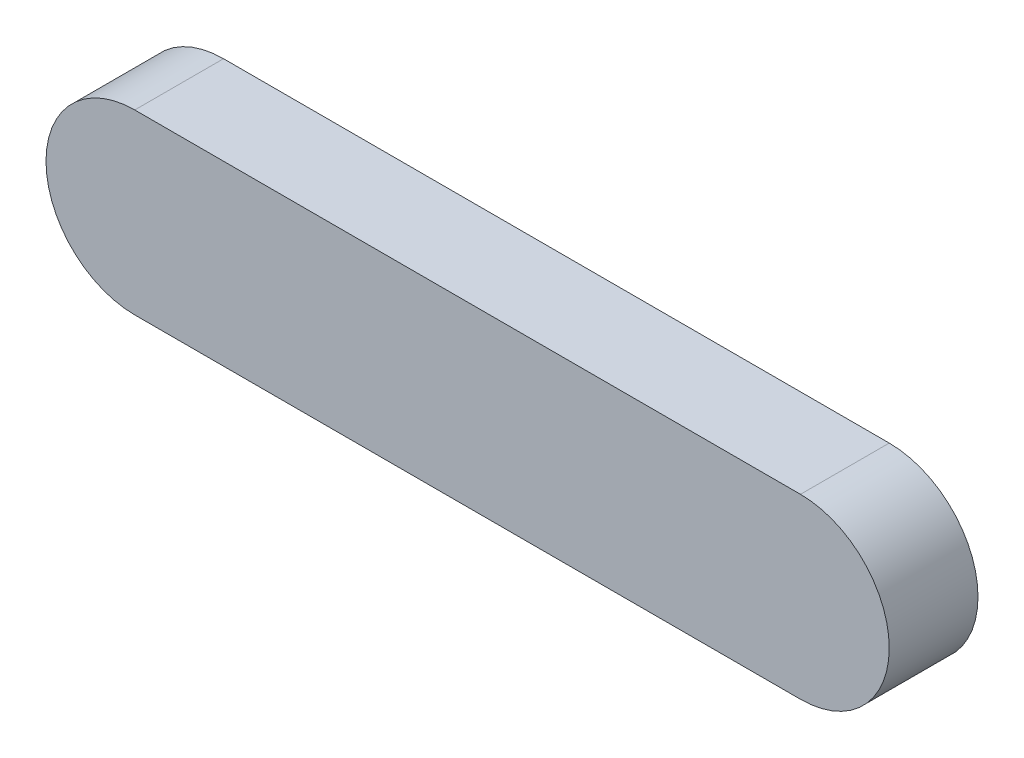
ISO-10303-21;
HEADER;
FILE_DESCRIPTION(('STEP AP214'),'2;1');
FILE_NAME('part.step','',(''),(''),'','','');
FILE_SCHEMA(('AUTOMOTIVE_DESIGN { 1 0 10303 214 1 1 1 1 }'));
ENDSEC;
DATA;
#1=APPLICATION_CONTEXT('core data for automotive mechanical design processes');
#2=APPLICATION_PROTOCOL_DEFINITION('international standard','automotive_design',2000,#1);
#3=PRODUCT_CONTEXT('',#1,'mechanical');
#4=PRODUCT('Part','Part','',(#3));
#5=PRODUCT_RELATED_PRODUCT_CATEGORY('part','',(#4));
#6=PRODUCT_DEFINITION_FORMATION('','',#4);
#7=PRODUCT_DEFINITION_CONTEXT('part definition',#1,'design');
#8=PRODUCT_DEFINITION('design','',#6,#7);
#9=PRODUCT_DEFINITION_SHAPE('','',#8);
#10=(LENGTH_UNIT() NAMED_UNIT(*) SI_UNIT(.MILLI.,.METRE.));
#11=(NAMED_UNIT(*) PLANE_ANGLE_UNIT() SI_UNIT($,.RADIAN.));
#12=(NAMED_UNIT(*) SI_UNIT($,.STERADIAN.) SOLID_ANGLE_UNIT());
#13=UNCERTAINTY_MEASURE_WITH_UNIT(LENGTH_MEASURE(1.E-05),#10,'distance_accuracy_value','');
#14=(GEOMETRIC_REPRESENTATION_CONTEXT(3) GLOBAL_UNCERTAINTY_ASSIGNED_CONTEXT((#13)) GLOBAL_UNIT_ASSIGNED_CONTEXT((#10,
#11,#12)) REPRESENTATION_CONTEXT('',''));
#15=CARTESIAN_POINT('',(0.,0.,0.));
#16=DIRECTION('',(0.,0.,1.));
#17=DIRECTION('',(1.,0.,0.));
#18=AXIS2_PLACEMENT_3D('',#15,#16,#17);
#19=CARTESIAN_POINT('',(0.,20.,20.));
#20=DIRECTION('',(0.,1.,0.));
#21=DIRECTION('',(0.,0.,1.));
#22=AXIS2_PLACEMENT_3D('',#19,#20,#21);
#23=PLANE('',#22);
#24=DIRECTION('',(1.,0.,0.));
#25=VECTOR('',#24,1.);
#26=CARTESIAN_POINT('',(0.,20.,0.));
#27=LINE('',#26,#25);
#28=CARTESIAN_POINT('',(-75.,20.,0.));
#29=VERTEX_POINT('',#28);
#30=CARTESIAN_POINT('',(75.,20.,0.));
#31=VERTEX_POINT('',#30);
#32=EDGE_CURVE('E98',#29,#31,#27,.T.);
#33=ORIENTED_EDGE('',*,*,#32,.F.);
#34=DIRECTION('',(0.,0.,-1.));
#35=VECTOR('',#34,1.);
#36=CARTESIAN_POINT('',(-75.,20.,20.));
#37=LINE('',#36,#35);
#38=CARTESIAN_POINT('',(-75.,20.,20.));
#39=VERTEX_POINT('',#38);
#40=EDGE_CURVE('E11',#39,#29,#37,.T.);
#41=ORIENTED_EDGE('',*,*,#40,.F.);
#42=DIRECTION('',(1.,0.,0.));
#43=VECTOR('',#42,1.);
#44=CARTESIAN_POINT('',(0.,20.,20.));
#45=LINE('',#44,#43);
#46=CARTESIAN_POINT('',(75.,20.,20.));
#47=VERTEX_POINT('',#46);
#48=EDGE_CURVE('E83',#39,#47,#45,.T.);
#49=ORIENTED_EDGE('',*,*,#48,.T.);
#50=DIRECTION('',(0.,0.,-1.));
#51=VECTOR('',#50,1.);
#52=CARTESIAN_POINT('',(75.,20.,20.));
#53=LINE('',#52,#51);
#54=EDGE_CURVE('E51',#47,#31,#53,.T.);
#55=ORIENTED_EDGE('',*,*,#54,.T.);
#56=EDGE_LOOP('',(#33,#41,#49,#55));
#57=FACE_BOUND('',#56,.T.);
#58=ADVANCED_FACE('F35',(#57),#23,.T.);
#59=CARTESIAN_POINT('',(-75.,0.,20.));
#60=DIRECTION('',(0.,0.,-1.));
#61=DIRECTION('',(-1.,0.,0.));
#62=AXIS2_PLACEMENT_3D('',#59,#60,#61);
#63=CYLINDRICAL_SURFACE('',#62,20.);
#64=CARTESIAN_POINT('',(-75.,0.,0.));
#65=DIRECTION('',(0.,0.,1.));
#66=DIRECTION('',(1.,0.,0.));
#67=AXIS2_PLACEMENT_3D('',#64,#65,#66);
#68=CIRCLE('',#67,20.);
#69=CARTESIAN_POINT('',(-75.,-20.,0.));
#70=VERTEX_POINT('',#69);
#71=EDGE_CURVE('E89',#29,#70,#68,.T.);
#72=ORIENTED_EDGE('',*,*,#71,.T.);
#73=DIRECTION('',(0.,0.,-1.));
#74=VECTOR('',#73,1.);
#75=CARTESIAN_POINT('',(-75.,-20.,20.));
#76=LINE('',#75,#74);
#77=CARTESIAN_POINT('',(-75.,-20.,20.));
#78=VERTEX_POINT('',#77);
#79=EDGE_CURVE('E43',#78,#70,#76,.T.);
#80=ORIENTED_EDGE('',*,*,#79,.F.);
#81=CARTESIAN_POINT('',(-75.,0.,20.));
#82=DIRECTION('',(0.,0.,1.));
#83=DIRECTION('',(1.,0.,0.));
#84=AXIS2_PLACEMENT_3D('',#81,#82,#83);
#85=CIRCLE('',#84,20.);
#86=EDGE_CURVE('E77',#39,#78,#85,.T.);
#87=ORIENTED_EDGE('',*,*,#86,.F.);
#88=ORIENTED_EDGE('',*,*,#40,.T.);
#89=EDGE_LOOP('',(#72,#80,#87,#88));
#90=FACE_BOUND('',#89,.T.);
#91=ADVANCED_FACE('F87',(#90),#63,.T.);
#92=CARTESIAN_POINT('',(0.,-20.,20.));
#93=DIRECTION('',(0.,-1.,0.));
#94=DIRECTION('',(0.,0.,-1.));
#95=AXIS2_PLACEMENT_3D('',#92,#93,#94);
#96=PLANE('',#95);
#97=DIRECTION('',(-1.,0.,0.));
#98=VECTOR('',#97,1.);
#99=CARTESIAN_POINT('',(0.,-20.,0.));
#100=LINE('',#99,#98);
#101=CARTESIAN_POINT('',(75.,-20.,0.));
#102=VERTEX_POINT('',#101);
#103=EDGE_CURVE('E101',#102,#70,#100,.T.);
#104=ORIENTED_EDGE('',*,*,#103,.F.);
#105=DIRECTION('',(0.,0.,-1.));
#106=VECTOR('',#105,1.);
#107=CARTESIAN_POINT('',(75.,-20.,20.));
#108=LINE('',#107,#106);
#109=CARTESIAN_POINT('',(75.,-20.,20.));
#110=VERTEX_POINT('',#109);
#111=EDGE_CURVE('E64',#110,#102,#108,.T.);
#112=ORIENTED_EDGE('',*,*,#111,.F.);
#113=DIRECTION('',(-1.,0.,0.));
#114=VECTOR('',#113,1.);
#115=CARTESIAN_POINT('',(0.,-20.,20.));
#116=LINE('',#115,#114);
#117=EDGE_CURVE('E82',#110,#78,#116,.T.);
#118=ORIENTED_EDGE('',*,*,#117,.T.);
#119=ORIENTED_EDGE('',*,*,#79,.T.);
#120=EDGE_LOOP('',(#104,#112,#118,#119));
#121=FACE_BOUND('',#120,.T.);
#122=ADVANCED_FACE('F92',(#121),#96,.T.);
#123=CARTESIAN_POINT('',(75.,0.,20.));
#124=DIRECTION('',(0.,0.,-1.));
#125=DIRECTION('',(-1.,0.,0.));
#126=AXIS2_PLACEMENT_3D('',#123,#124,#125);
#127=CYLINDRICAL_SURFACE('',#126,20.);
#128=CARTESIAN_POINT('',(75.,0.,0.));
#129=DIRECTION('',(0.,0.,1.));
#130=DIRECTION('',(1.,0.,0.));
#131=AXIS2_PLACEMENT_3D('',#128,#129,#130);
#132=CIRCLE('',#131,20.);
#133=EDGE_CURVE('E103',#31,#102,#132,.F.);
#134=ORIENTED_EDGE('',*,*,#133,.F.);
#135=ORIENTED_EDGE('',*,*,#54,.F.);
#136=CARTESIAN_POINT('',(75.,0.,20.));
#137=DIRECTION('',(0.,0.,1.));
#138=DIRECTION('',(1.,0.,0.));
#139=AXIS2_PLACEMENT_3D('',#136,#137,#138);
#140=CIRCLE('',#139,20.);
#141=EDGE_CURVE('E93',#47,#110,#140,.F.);
#142=ORIENTED_EDGE('',*,*,#141,.T.);
#143=ORIENTED_EDGE('',*,*,#111,.T.);
#144=EDGE_LOOP('',(#134,#135,#142,#143));
#145=FACE_BOUND('',#144,.T.);
#146=ADVANCED_FACE('F108',(#145),#127,.T.);
#147=CARTESIAN_POINT('',(0.,0.,20.));
#148=DIRECTION('',(0.,0.,1.));
#149=DIRECTION('',(1.,0.,0.));
#150=AXIS2_PLACEMENT_3D('',#147,#148,#149);
#151=PLANE('',#150);
#152=ORIENTED_EDGE('',*,*,#48,.F.);
#153=ORIENTED_EDGE('',*,*,#86,.T.);
#154=ORIENTED_EDGE('',*,*,#117,.F.);
#155=ORIENTED_EDGE('',*,*,#141,.F.);
#156=EDGE_LOOP('',(#152,#153,#154,#155));
#157=FACE_BOUND('',#156,.T.);
#158=ADVANCED_FACE('F79',(#157),#151,.T.);
#159=CARTESIAN_POINT('',(0.,0.,0.));
#160=DIRECTION('',(0.,0.,1.));
#161=DIRECTION('',(1.,0.,0.));
#162=AXIS2_PLACEMENT_3D('',#159,#160,#161);
#163=PLANE('',#162);
#164=ORIENTED_EDGE('',*,*,#32,.T.);
#165=ORIENTED_EDGE('',*,*,#133,.T.);
#166=ORIENTED_EDGE('',*,*,#103,.T.);
#167=ORIENTED_EDGE('',*,*,#71,.F.);
#168=EDGE_LOOP('',(#164,#165,#166,#167));
#169=FACE_BOUND('',#168,.T.);
#170=ADVANCED_FACE('F115',(#169),#163,.F.);
#171=CLOSED_SHELL('',(#58,#91,#122,#146,#158,#170));
#172=MANIFOLD_SOLID_BREP('B2',#171);
#173=ADVANCED_BREP_SHAPE_REPRESENTATION('',(#18,#172),#14);
#174=SHAPE_DEFINITION_REPRESENTATION(#9,#173);
ENDSEC;
END-ISO-10303-21;
